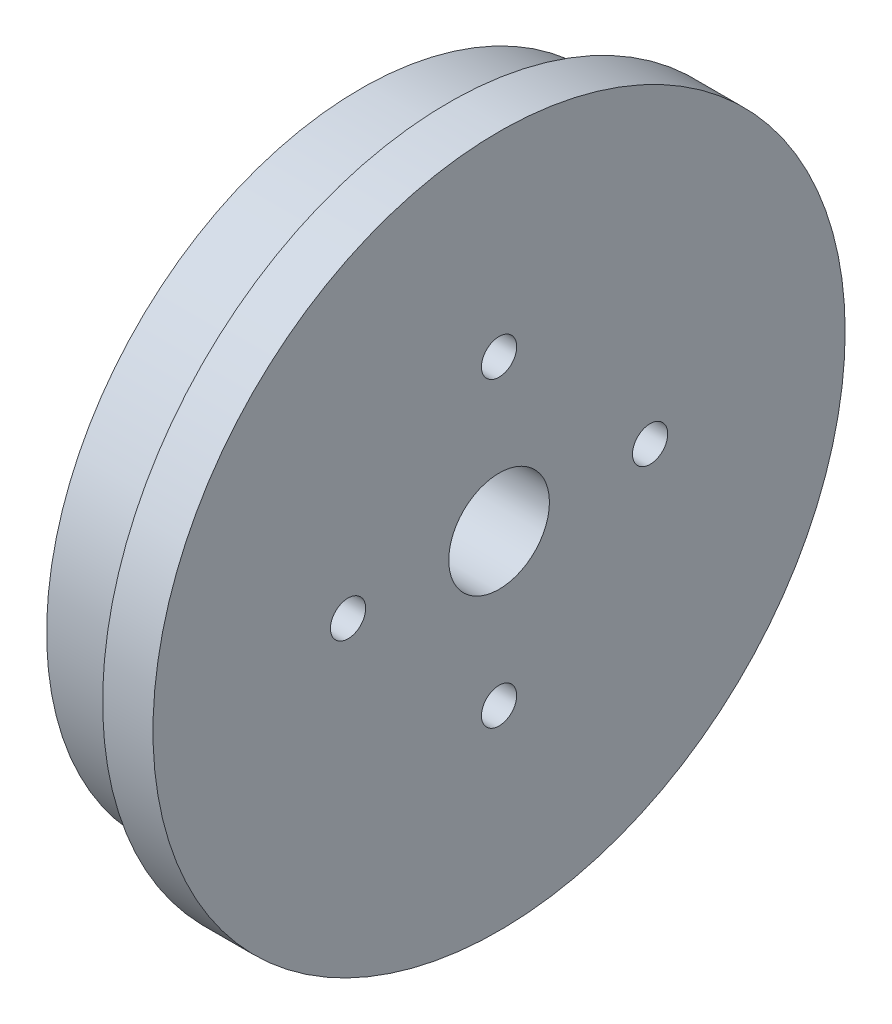
ISO-10303-21;
HEADER;
FILE_DESCRIPTION(('STEP AP214'),'2;1');
FILE_NAME('part.step','',(''),(''),'','','');
FILE_SCHEMA(('AUTOMOTIVE_DESIGN { 1 0 10303 214 1 1 1 1 }'));
ENDSEC;
DATA;
#1=APPLICATION_CONTEXT('core data for automotive mechanical design processes');
#2=APPLICATION_PROTOCOL_DEFINITION('international standard','automotive_design',2000,#1);
#3=PRODUCT_CONTEXT('',#1,'mechanical');
#4=PRODUCT('Part','Part','',(#3));
#5=PRODUCT_RELATED_PRODUCT_CATEGORY('part','',(#4));
#6=PRODUCT_DEFINITION_FORMATION('','',#4);
#7=PRODUCT_DEFINITION_CONTEXT('part definition',#1,'design');
#8=PRODUCT_DEFINITION('design','',#6,#7);
#9=PRODUCT_DEFINITION_SHAPE('','',#8);
#10=(LENGTH_UNIT() NAMED_UNIT(*) SI_UNIT(.MILLI.,.METRE.));
#11=(NAMED_UNIT(*) PLANE_ANGLE_UNIT() SI_UNIT($,.RADIAN.));
#12=(NAMED_UNIT(*) SI_UNIT($,.STERADIAN.) SOLID_ANGLE_UNIT());
#13=UNCERTAINTY_MEASURE_WITH_UNIT(LENGTH_MEASURE(1.E-05),#10,'distance_accuracy_value','');
#14=(GEOMETRIC_REPRESENTATION_CONTEXT(3) GLOBAL_UNCERTAINTY_ASSIGNED_CONTEXT((#13)) GLOBAL_UNIT_ASSIGNED_CONTEXT((#10,
#11,#12)) REPRESENTATION_CONTEXT('',''));
#15=CARTESIAN_POINT('',(0.,0.,0.));
#16=DIRECTION('',(0.,0.,1.));
#17=DIRECTION('',(1.,0.,0.));
#18=AXIS2_PLACEMENT_3D('',#15,#16,#17);
#19=CARTESIAN_POINT('',(7.,0.,0.));
#20=DIRECTION('',(-1.,0.,0.));
#21=DIRECTION('',(0.,0.,1.));
#22=AXIS2_PLACEMENT_3D('',#19,#20,#21);
#23=CYLINDRICAL_SURFACE('',#22,24.95);
#24=CARTESIAN_POINT('',(7.,0.,0.));
#25=DIRECTION('',(1.,0.,0.));
#26=DIRECTION('',(0.,0.,-1.));
#27=AXIS2_PLACEMENT_3D('',#24,#25,#26);
#28=CIRCLE('',#27,24.95);
#29=CARTESIAN_POINT('',(7.,0.,-24.95));
#30=VERTEX_POINT('',#29);
#31=EDGE_CURVE('E10',#30,#30,#28,.T.);
#32=ORIENTED_EDGE('',*,*,#31,.F.);
#33=EDGE_LOOP('',(#32));
#34=FACE_BOUND('',#33,.T.);
#35=CARTESIAN_POINT('',(0.,0.,0.));
#36=DIRECTION('',(1.,0.,0.));
#37=DIRECTION('',(0.,0.,-1.));
#38=AXIS2_PLACEMENT_3D('',#35,#36,#37);
#39=CIRCLE('',#38,24.95);
#40=CARTESIAN_POINT('',(0.,0.,-24.95));
#41=VERTEX_POINT('',#40);
#42=EDGE_CURVE('E37',#41,#41,#39,.T.);
#43=ORIENTED_EDGE('',*,*,#42,.T.);
#44=EDGE_LOOP('',(#43));
#45=FACE_BOUND('',#44,.T.);
#46=ADVANCED_FACE('F40',(#34,#45),#23,.T.);
#47=CARTESIAN_POINT('',(0.,0.,0.));
#48=DIRECTION('',(1.,0.,0.));
#49=DIRECTION('',(0.,0.,-1.));
#50=AXIS2_PLACEMENT_3D('',#47,#48,#49);
#51=PLANE('',#50);
#52=CARTESIAN_POINT('',(0.,20.,0.));
#53=DIRECTION('',(-1.,0.,0.));
#54=DIRECTION('',(0.,0.,1.));
#55=AXIS2_PLACEMENT_3D('',#52,#53,#54);
#56=CIRCLE('',#55,3.);
#57=CARTESIAN_POINT('',(0.,20.,3.));
#58=VERTEX_POINT('',#57);
#59=EDGE_CURVE('E109',#58,#58,#56,.T.);
#60=ORIENTED_EDGE('',*,*,#59,.F.);
#61=EDGE_LOOP('',(#60));
#62=FACE_BOUND('',#61,.T.);
#63=CARTESIAN_POINT('',(0.,9.,-17.3205080756888));
#64=DIRECTION('',(-1.,0.,0.));
#65=DIRECTION('',(0.,0.,1.));
#66=AXIS2_PLACEMENT_3D('',#63,#64,#65);
#67=CIRCLE('',#66,3.);
#68=CARTESIAN_POINT('',(0.,9.,-14.3205080756888));
#69=VERTEX_POINT('',#68);
#70=EDGE_CURVE('E90',#69,#69,#67,.T.);
#71=ORIENTED_EDGE('',*,*,#70,.F.);
#72=EDGE_LOOP('',(#71));
#73=FACE_BOUND('',#72,.T.);
#74=CARTESIAN_POINT('',(0.,-11.5000000000001,-16.4544826719044));
#75=DIRECTION('',(-1.,0.,0.));
#76=DIRECTION('',(0.,0.,1.));
#77=AXIS2_PLACEMENT_3D('',#74,#75,#76);
#78=CIRCLE('',#77,3.);
#79=CARTESIAN_POINT('',(0.,-11.5000000000001,-13.4544826719044));
#80=VERTEX_POINT('',#79);
#81=EDGE_CURVE('E86',#80,#80,#78,.T.);
#82=ORIENTED_EDGE('',*,*,#81,.F.);
#83=EDGE_LOOP('',(#82));
#84=FACE_BOUND('',#83,.T.);
#85=CARTESIAN_POINT('',(0.,-21.0000000000001,1.73205080756882));
#86=DIRECTION('',(-1.,0.,0.));
#87=DIRECTION('',(0.,0.,1.));
#88=AXIS2_PLACEMENT_3D('',#85,#86,#87);
#89=CIRCLE('',#88,3.);
#90=CARTESIAN_POINT('',(0.,-21.0000000000001,4.73205080756882));
#91=VERTEX_POINT('',#90);
#92=EDGE_CURVE('E92',#91,#91,#89,.T.);
#93=ORIENTED_EDGE('',*,*,#92,.F.);
#94=EDGE_LOOP('',(#93));
#95=FACE_BOUND('',#94,.T.);
#96=CARTESIAN_POINT('',(0.,-10.0000000000001,19.0525588832577));
#97=DIRECTION('',(-1.,0.,0.));
#98=DIRECTION('',(0.,0.,1.));
#99=AXIS2_PLACEMENT_3D('',#96,#97,#98);
#100=CIRCLE('',#99,3.);
#101=CARTESIAN_POINT('',(0.,-10.0000000000001,22.0525588832577));
#102=VERTEX_POINT('',#101);
#103=EDGE_CURVE('E101',#102,#102,#100,.T.);
#104=ORIENTED_EDGE('',*,*,#103,.F.);
#105=EDGE_LOOP('',(#104));
#106=FACE_BOUND('',#105,.T.);
#107=CARTESIAN_POINT('',(0.,10.5,18.1865334794732));
#108=DIRECTION('',(-1.,0.,0.));
#109=DIRECTION('',(0.,0.,1.));
#110=AXIS2_PLACEMENT_3D('',#107,#108,#109);
#111=CIRCLE('',#110,3.);
#112=CARTESIAN_POINT('',(0.,10.5,21.1865334794732));
#113=VERTEX_POINT('',#112);
#114=EDGE_CURVE('E110',#113,#113,#111,.T.);
#115=ORIENTED_EDGE('',*,*,#114,.F.);
#116=EDGE_LOOP('',(#115));
#117=FACE_BOUND('',#116,.T.);
#118=CARTESIAN_POINT('',(0.,0.,0.));
#119=DIRECTION('',(1.,0.,0.));
#120=DIRECTION('',(0.,0.,-1.));
#121=AXIS2_PLACEMENT_3D('',#118,#119,#120);
#122=CIRCLE('',#121,4.);
#123=CARTESIAN_POINT('',(0.,0.,-4.));
#124=VERTEX_POINT('',#123);
#125=EDGE_CURVE('E55',#124,#124,#122,.T.);
#126=ORIENTED_EDGE('',*,*,#125,.T.);
#127=EDGE_LOOP('',(#126));
#128=FACE_BOUND('',#127,.T.);
#129=ORIENTED_EDGE('',*,*,#42,.F.);
#130=EDGE_LOOP('',(#129));
#131=FACE_BOUND('',#130,.T.);
#132=ADVANCED_FACE('F128',(#62,#73,#84,#95,#106,#117,#128,#131),#51,.F.);
#133=CARTESIAN_POINT('',(11.,0.,0.));
#134=DIRECTION('',(-1.,0.,0.));
#135=DIRECTION('',(0.,0.,1.));
#136=AXIS2_PLACEMENT_3D('',#133,#134,#135);
#137=CYLINDRICAL_SURFACE('',#136,27.5);
#138=CARTESIAN_POINT('',(11.,0.,0.));
#139=DIRECTION('',(1.,0.,0.));
#140=DIRECTION('',(0.,0.,-1.));
#141=AXIS2_PLACEMENT_3D('',#138,#139,#140);
#142=CIRCLE('',#141,27.5);
#143=CARTESIAN_POINT('',(11.,0.,-27.5));
#144=VERTEX_POINT('',#143);
#145=EDGE_CURVE('E50',#144,#144,#142,.T.);
#146=ORIENTED_EDGE('',*,*,#145,.F.);
#147=EDGE_LOOP('',(#146));
#148=FACE_BOUND('',#147,.T.);
#149=CARTESIAN_POINT('',(7.,0.,0.));
#150=DIRECTION('',(1.,0.,0.));
#151=DIRECTION('',(0.,0.,-1.));
#152=AXIS2_PLACEMENT_3D('',#149,#150,#151);
#153=CIRCLE('',#152,27.5);
#154=CARTESIAN_POINT('',(7.,0.,-27.5));
#155=VERTEX_POINT('',#154);
#156=EDGE_CURVE('E47',#155,#155,#153,.T.);
#157=ORIENTED_EDGE('',*,*,#156,.T.);
#158=EDGE_LOOP('',(#157));
#159=FACE_BOUND('',#158,.T.);
#160=ADVANCED_FACE('F132',(#148,#159),#137,.T.);
#161=CARTESIAN_POINT('',(11.,0.,0.));
#162=DIRECTION('',(1.,0.,0.));
#163=DIRECTION('',(0.,0.,-1.));
#164=AXIS2_PLACEMENT_3D('',#161,#162,#163);
#165=PLANE('',#164);
#166=CARTESIAN_POINT('',(11.,0.,12.));
#167=DIRECTION('',(1.,0.,0.));
#168=DIRECTION('',(0.,0.,-1.));
#169=AXIS2_PLACEMENT_3D('',#166,#167,#168);
#170=CIRCLE('',#169,1.4);
#171=CARTESIAN_POINT('',(11.,0.,10.6));
#172=VERTEX_POINT('',#171);
#173=EDGE_CURVE('E79',#172,#172,#170,.T.);
#174=ORIENTED_EDGE('',*,*,#173,.F.);
#175=EDGE_LOOP('',(#174));
#176=FACE_BOUND('',#175,.T.);
#177=CARTESIAN_POINT('',(11.,12.,0.));
#178=DIRECTION('',(1.,0.,0.));
#179=DIRECTION('',(0.,0.,-1.));
#180=AXIS2_PLACEMENT_3D('',#177,#178,#179);
#181=CIRCLE('',#180,1.4);
#182=CARTESIAN_POINT('',(11.,12.,-1.40000000000004));
#183=VERTEX_POINT('',#182);
#184=EDGE_CURVE('E80',#183,#183,#181,.T.);
#185=ORIENTED_EDGE('',*,*,#184,.F.);
#186=EDGE_LOOP('',(#185));
#187=FACE_BOUND('',#186,.T.);
#188=CARTESIAN_POINT('',(11.,0.,-12.));
#189=DIRECTION('',(1.,0.,0.));
#190=DIRECTION('',(0.,0.,-1.));
#191=AXIS2_PLACEMENT_3D('',#188,#189,#190);
#192=CIRCLE('',#191,1.4);
#193=CARTESIAN_POINT('',(11.,0.,-13.4));
#194=VERTEX_POINT('',#193);
#195=EDGE_CURVE('E72',#194,#194,#192,.T.);
#196=ORIENTED_EDGE('',*,*,#195,.F.);
#197=EDGE_LOOP('',(#196));
#198=FACE_BOUND('',#197,.T.);
#199=CARTESIAN_POINT('',(11.,-12.,1.25693328198353E-13));
#200=DIRECTION('',(1.,0.,0.));
#201=DIRECTION('',(0.,0.,-1.));
#202=AXIS2_PLACEMENT_3D('',#199,#200,#201);
#203=CIRCLE('',#202,1.4);
#204=CARTESIAN_POINT('',(11.,-12.,-1.39999999999987));
#205=VERTEX_POINT('',#204);
#206=EDGE_CURVE('E63',#205,#205,#203,.T.);
#207=ORIENTED_EDGE('',*,*,#206,.F.);
#208=EDGE_LOOP('',(#207));
#209=FACE_BOUND('',#208,.T.);
#210=CARTESIAN_POINT('',(11.,0.,0.));
#211=DIRECTION('',(1.,0.,0.));
#212=DIRECTION('',(0.,0.,-1.));
#213=AXIS2_PLACEMENT_3D('',#210,#211,#212);
#214=CIRCLE('',#213,4.);
#215=CARTESIAN_POINT('',(11.,0.,-4.));
#216=VERTEX_POINT('',#215);
#217=EDGE_CURVE('E54',#216,#216,#214,.T.);
#218=ORIENTED_EDGE('',*,*,#217,.F.);
#219=EDGE_LOOP('',(#218));
#220=FACE_BOUND('',#219,.T.);
#221=ORIENTED_EDGE('',*,*,#145,.T.);
#222=EDGE_LOOP('',(#221));
#223=FACE_BOUND('',#222,.T.);
#224=ADVANCED_FACE('F159',(#176,#187,#198,#209,#220,#223),#165,.T.);
#225=CARTESIAN_POINT('',(7.,0.,0.));
#226=DIRECTION('',(1.,0.,0.));
#227=DIRECTION('',(0.,0.,-1.));
#228=AXIS2_PLACEMENT_3D('',#225,#226,#227);
#229=PLANE('',#228);
#230=ORIENTED_EDGE('',*,*,#31,.T.);
#231=EDGE_LOOP('',(#230));
#232=FACE_BOUND('',#231,.T.);
#233=ORIENTED_EDGE('',*,*,#156,.F.);
#234=EDGE_LOOP('',(#233));
#235=FACE_BOUND('',#234,.T.);
#236=ADVANCED_FACE('F170',(#232,#235),#229,.F.);
#237=CARTESIAN_POINT('',(0.,0.,0.));
#238=DIRECTION('',(1.,0.,0.));
#239=DIRECTION('',(0.,0.,-1.));
#240=AXIS2_PLACEMENT_3D('',#237,#238,#239);
#241=CYLINDRICAL_SURFACE('',#240,4.);
#242=ORIENTED_EDGE('',*,*,#125,.F.);
#243=EDGE_LOOP('',(#242));
#244=FACE_BOUND('',#243,.T.);
#245=ORIENTED_EDGE('',*,*,#217,.T.);
#246=EDGE_LOOP('',(#245));
#247=FACE_BOUND('',#246,.T.);
#248=ADVANCED_FACE('F171',(#244,#247),#241,.F.);
#249=CARTESIAN_POINT('',(3.,-12.,1.25693328198353E-13));
#250=DIRECTION('',(1.,0.,0.));
#251=DIRECTION('',(0.,0.,-1.));
#252=AXIS2_PLACEMENT_3D('',#249,#250,#251);
#253=CYLINDRICAL_SURFACE('',#252,1.4);
#254=CARTESIAN_POINT('',(3.,-12.,1.25693328198353E-13));
#255=DIRECTION('',(1.,0.,0.));
#256=DIRECTION('',(0.,0.,-1.));
#257=AXIS2_PLACEMENT_3D('',#254,#255,#256);
#258=CIRCLE('',#257,1.4);
#259=CARTESIAN_POINT('',(3.,-12.,-1.39999999999987));
#260=VERTEX_POINT('',#259);
#261=EDGE_CURVE('E61',#260,#260,#258,.T.);
#262=ORIENTED_EDGE('',*,*,#261,.F.);
#263=EDGE_LOOP('',(#262));
#264=FACE_BOUND('',#263,.T.);
#265=ORIENTED_EDGE('',*,*,#206,.T.);
#266=EDGE_LOOP('',(#265));
#267=FACE_BOUND('',#266,.T.);
#268=ADVANCED_FACE('F177',(#264,#267),#253,.F.);
#269=CARTESIAN_POINT('',(3.,-12.,1.25693328198353E-13));
#270=DIRECTION('',(1.,0.,0.));
#271=DIRECTION('',(0.,0.,-1.));
#272=AXIS2_PLACEMENT_3D('',#269,#270,#271);
#273=PLANE('',#272);
#274=ORIENTED_EDGE('',*,*,#261,.T.);
#275=EDGE_LOOP('',(#274));
#276=FACE_BOUND('',#275,.T.);
#277=ADVANCED_FACE('F194',(#276),#273,.T.);
#278=CARTESIAN_POINT('',(3.,0.,-12.));
#279=DIRECTION('',(1.,0.,0.));
#280=DIRECTION('',(0.,0.,-1.));
#281=AXIS2_PLACEMENT_3D('',#278,#279,#280);
#282=CYLINDRICAL_SURFACE('',#281,1.4);
#283=CARTESIAN_POINT('',(3.,0.,-12.));
#284=DIRECTION('',(1.,0.,0.));
#285=DIRECTION('',(0.,0.,-1.));
#286=AXIS2_PLACEMENT_3D('',#283,#284,#285);
#287=CIRCLE('',#286,1.4);
#288=CARTESIAN_POINT('',(3.,0.,-13.4));
#289=VERTEX_POINT('',#288);
#290=EDGE_CURVE('E66',#289,#289,#287,.T.);
#291=ORIENTED_EDGE('',*,*,#290,.F.);
#292=EDGE_LOOP('',(#291));
#293=FACE_BOUND('',#292,.T.);
#294=ORIENTED_EDGE('',*,*,#195,.T.);
#295=EDGE_LOOP('',(#294));
#296=FACE_BOUND('',#295,.T.);
#297=ADVANCED_FACE('F204',(#293,#296),#282,.F.);
#298=CARTESIAN_POINT('',(3.,0.,-12.));
#299=DIRECTION('',(1.,0.,0.));
#300=DIRECTION('',(0.,0.,-1.));
#301=AXIS2_PLACEMENT_3D('',#298,#299,#300);
#302=PLANE('',#301);
#303=ORIENTED_EDGE('',*,*,#290,.T.);
#304=EDGE_LOOP('',(#303));
#305=FACE_BOUND('',#304,.T.);
#306=ADVANCED_FACE('F213',(#305),#302,.T.);
#307=CARTESIAN_POINT('',(3.,12.,0.));
#308=DIRECTION('',(1.,0.,0.));
#309=DIRECTION('',(0.,0.,-1.));
#310=AXIS2_PLACEMENT_3D('',#307,#308,#309);
#311=CYLINDRICAL_SURFACE('',#310,1.4);
#312=CARTESIAN_POINT('',(3.,12.,0.));
#313=DIRECTION('',(1.,0.,0.));
#314=DIRECTION('',(0.,0.,-1.));
#315=AXIS2_PLACEMENT_3D('',#312,#313,#314);
#316=CIRCLE('',#315,1.4);
#317=CARTESIAN_POINT('',(3.,12.,-1.40000000000004));
#318=VERTEX_POINT('',#317);
#319=EDGE_CURVE('E74',#318,#318,#316,.T.);
#320=ORIENTED_EDGE('',*,*,#319,.F.);
#321=EDGE_LOOP('',(#320));
#322=FACE_BOUND('',#321,.T.);
#323=ORIENTED_EDGE('',*,*,#184,.T.);
#324=EDGE_LOOP('',(#323));
#325=FACE_BOUND('',#324,.T.);
#326=ADVANCED_FACE('F225',(#322,#325),#311,.F.);
#327=CARTESIAN_POINT('',(3.,12.,0.));
#328=DIRECTION('',(1.,0.,0.));
#329=DIRECTION('',(0.,0.,-1.));
#330=AXIS2_PLACEMENT_3D('',#327,#328,#329);
#331=PLANE('',#330);
#332=ORIENTED_EDGE('',*,*,#319,.T.);
#333=EDGE_LOOP('',(#332));
#334=FACE_BOUND('',#333,.T.);
#335=ADVANCED_FACE('F233',(#334),#331,.T.);
#336=CARTESIAN_POINT('',(3.,0.,12.));
#337=DIRECTION('',(1.,0.,0.));
#338=DIRECTION('',(0.,0.,-1.));
#339=AXIS2_PLACEMENT_3D('',#336,#337,#338);
#340=CYLINDRICAL_SURFACE('',#339,1.4);
#341=CARTESIAN_POINT('',(3.,0.,12.));
#342=DIRECTION('',(1.,0.,0.));
#343=DIRECTION('',(0.,0.,-1.));
#344=AXIS2_PLACEMENT_3D('',#341,#342,#343);
#345=CIRCLE('',#344,1.4);
#346=CARTESIAN_POINT('',(3.,0.,10.6));
#347=VERTEX_POINT('',#346);
#348=EDGE_CURVE('E59',#347,#347,#345,.T.);
#349=ORIENTED_EDGE('',*,*,#348,.F.);
#350=EDGE_LOOP('',(#349));
#351=FACE_BOUND('',#350,.T.);
#352=ORIENTED_EDGE('',*,*,#173,.T.);
#353=EDGE_LOOP('',(#352));
#354=FACE_BOUND('',#353,.T.);
#355=ADVANCED_FACE('F238',(#351,#354),#340,.F.);
#356=CARTESIAN_POINT('',(3.,0.,12.));
#357=DIRECTION('',(1.,0.,0.));
#358=DIRECTION('',(0.,0.,-1.));
#359=AXIS2_PLACEMENT_3D('',#356,#357,#358);
#360=PLANE('',#359);
#361=ORIENTED_EDGE('',*,*,#348,.T.);
#362=EDGE_LOOP('',(#361));
#363=FACE_BOUND('',#362,.T.);
#364=ADVANCED_FACE('F247',(#363),#360,.T.);
#365=CARTESIAN_POINT('',(6.,10.5,18.1865334794732));
#366=DIRECTION('',(-1.,0.,0.));
#367=DIRECTION('',(0.,0.,1.));
#368=AXIS2_PLACEMENT_3D('',#365,#366,#367);
#369=CYLINDRICAL_SURFACE('',#368,3.);
#370=CARTESIAN_POINT('',(6.,10.5,18.1865334794732));
#371=DIRECTION('',(-1.,0.,0.));
#372=DIRECTION('',(0.,0.,1.));
#373=AXIS2_PLACEMENT_3D('',#370,#371,#372);
#374=CIRCLE('',#373,3.);
#375=CARTESIAN_POINT('',(6.,10.5,21.1865334794732));
#376=VERTEX_POINT('',#375);
#377=EDGE_CURVE('E102',#376,#376,#374,.T.);
#378=ORIENTED_EDGE('',*,*,#377,.F.);
#379=EDGE_LOOP('',(#378));
#380=FACE_BOUND('',#379,.T.);
#381=ORIENTED_EDGE('',*,*,#114,.T.);
#382=EDGE_LOOP('',(#381));
#383=FACE_BOUND('',#382,.T.);
#384=ADVANCED_FACE('F260',(#380,#383),#369,.F.);
#385=CARTESIAN_POINT('',(6.,10.5,18.1865334794732));
#386=DIRECTION('',(-1.,0.,0.));
#387=DIRECTION('',(0.,0.,1.));
#388=AXIS2_PLACEMENT_3D('',#385,#386,#387);
#389=PLANE('',#388);
#390=ORIENTED_EDGE('',*,*,#377,.T.);
#391=EDGE_LOOP('',(#390));
#392=FACE_BOUND('',#391,.T.);
#393=ADVANCED_FACE('F271',(#392),#389,.T.);
#394=CARTESIAN_POINT('',(6.,-10.0000000000001,19.0525588832577));
#395=DIRECTION('',(-1.,0.,0.));
#396=DIRECTION('',(0.,0.,1.));
#397=AXIS2_PLACEMENT_3D('',#394,#395,#396);
#398=CYLINDRICAL_SURFACE('',#397,3.);
#399=CARTESIAN_POINT('',(6.,-10.0000000000001,19.0525588832577));
#400=DIRECTION('',(-1.,0.,0.));
#401=DIRECTION('',(0.,0.,1.));
#402=AXIS2_PLACEMENT_3D('',#399,#400,#401);
#403=CIRCLE('',#402,3.);
#404=CARTESIAN_POINT('',(6.,-10.0000000000001,22.0525588832577));
#405=VERTEX_POINT('',#404);
#406=EDGE_CURVE('E98',#405,#405,#403,.T.);
#407=ORIENTED_EDGE('',*,*,#406,.F.);
#408=EDGE_LOOP('',(#407));
#409=FACE_BOUND('',#408,.T.);
#410=ORIENTED_EDGE('',*,*,#103,.T.);
#411=EDGE_LOOP('',(#410));
#412=FACE_BOUND('',#411,.T.);
#413=ADVANCED_FACE('F278',(#409,#412),#398,.F.);
#414=CARTESIAN_POINT('',(6.,-10.0000000000001,19.0525588832577));
#415=DIRECTION('',(-1.,0.,0.));
#416=DIRECTION('',(0.,0.,1.));
#417=AXIS2_PLACEMENT_3D('',#414,#415,#416);
#418=PLANE('',#417);
#419=ORIENTED_EDGE('',*,*,#406,.T.);
#420=EDGE_LOOP('',(#419));
#421=FACE_BOUND('',#420,.T.);
#422=ADVANCED_FACE('F287',(#421),#418,.T.);
#423=CARTESIAN_POINT('',(6.,-21.0000000000001,1.73205080756882));
#424=DIRECTION('',(-1.,0.,0.));
#425=DIRECTION('',(0.,0.,1.));
#426=AXIS2_PLACEMENT_3D('',#423,#424,#425);
#427=CYLINDRICAL_SURFACE('',#426,3.);
#428=CARTESIAN_POINT('',(6.,-21.0000000000001,1.73205080756882));
#429=DIRECTION('',(-1.,0.,0.));
#430=DIRECTION('',(0.,0.,1.));
#431=AXIS2_PLACEMENT_3D('',#428,#429,#430);
#432=CIRCLE('',#431,3.);
#433=CARTESIAN_POINT('',(6.,-21.0000000000001,4.73205080756882));
#434=VERTEX_POINT('',#433);
#435=EDGE_CURVE('E95',#434,#434,#432,.T.);
#436=ORIENTED_EDGE('',*,*,#435,.F.);
#437=EDGE_LOOP('',(#436));
#438=FACE_BOUND('',#437,.T.);
#439=ORIENTED_EDGE('',*,*,#92,.T.);
#440=EDGE_LOOP('',(#439));
#441=FACE_BOUND('',#440,.T.);
#442=ADVANCED_FACE('F297',(#438,#441),#427,.F.);
#443=CARTESIAN_POINT('',(6.,-21.0000000000001,1.73205080756882));
#444=DIRECTION('',(-1.,0.,0.));
#445=DIRECTION('',(0.,0.,1.));
#446=AXIS2_PLACEMENT_3D('',#443,#444,#445);
#447=PLANE('',#446);
#448=ORIENTED_EDGE('',*,*,#435,.T.);
#449=EDGE_LOOP('',(#448));
#450=FACE_BOUND('',#449,.T.);
#451=ADVANCED_FACE('F307',(#450),#447,.T.);
#452=CARTESIAN_POINT('',(6.,-11.5000000000001,-16.4544826719044));
#453=DIRECTION('',(-1.,0.,0.));
#454=DIRECTION('',(0.,0.,1.));
#455=AXIS2_PLACEMENT_3D('',#452,#453,#454);
#456=CYLINDRICAL_SURFACE('',#455,3.);
#457=CARTESIAN_POINT('',(6.,-11.5000000000001,-16.4544826719044));
#458=DIRECTION('',(-1.,0.,0.));
#459=DIRECTION('',(0.,0.,1.));
#460=AXIS2_PLACEMENT_3D('',#457,#458,#459);
#461=CIRCLE('',#460,3.);
#462=CARTESIAN_POINT('',(6.,-11.5000000000001,-13.4544826719044));
#463=VERTEX_POINT('',#462);
#464=EDGE_CURVE('E84',#463,#463,#461,.T.);
#465=ORIENTED_EDGE('',*,*,#464,.F.);
#466=EDGE_LOOP('',(#465));
#467=FACE_BOUND('',#466,.T.);
#468=ORIENTED_EDGE('',*,*,#81,.T.);
#469=EDGE_LOOP('',(#468));
#470=FACE_BOUND('',#469,.T.);
#471=ADVANCED_FACE('F316',(#467,#470),#456,.F.);
#472=CARTESIAN_POINT('',(6.,-11.5000000000001,-16.4544826719044));
#473=DIRECTION('',(-1.,0.,0.));
#474=DIRECTION('',(0.,0.,1.));
#475=AXIS2_PLACEMENT_3D('',#472,#473,#474);
#476=PLANE('',#475);
#477=ORIENTED_EDGE('',*,*,#464,.T.);
#478=EDGE_LOOP('',(#477));
#479=FACE_BOUND('',#478,.T.);
#480=ADVANCED_FACE('F324',(#479),#476,.T.);
#481=CARTESIAN_POINT('',(6.,9.,-17.3205080756888));
#482=DIRECTION('',(-1.,0.,0.));
#483=DIRECTION('',(0.,0.,1.));
#484=AXIS2_PLACEMENT_3D('',#481,#482,#483);
#485=CYLINDRICAL_SURFACE('',#484,3.);
#486=CARTESIAN_POINT('',(6.,9.,-17.3205080756888));
#487=DIRECTION('',(-1.,0.,0.));
#488=DIRECTION('',(0.,0.,1.));
#489=AXIS2_PLACEMENT_3D('',#486,#487,#488);
#490=CIRCLE('',#489,3.);
#491=CARTESIAN_POINT('',(6.,9.,-14.3205080756888));
#492=VERTEX_POINT('',#491);
#493=EDGE_CURVE('E112',#492,#492,#490,.T.);
#494=ORIENTED_EDGE('',*,*,#493,.F.);
#495=EDGE_LOOP('',(#494));
#496=FACE_BOUND('',#495,.T.);
#497=ORIENTED_EDGE('',*,*,#70,.T.);
#498=EDGE_LOOP('',(#497));
#499=FACE_BOUND('',#498,.T.);
#500=ADVANCED_FACE('F331',(#496,#499),#485,.F.);
#501=CARTESIAN_POINT('',(6.,9.,-17.3205080756888));
#502=DIRECTION('',(-1.,0.,0.));
#503=DIRECTION('',(0.,0.,1.));
#504=AXIS2_PLACEMENT_3D('',#501,#502,#503);
#505=PLANE('',#504);
#506=ORIENTED_EDGE('',*,*,#493,.T.);
#507=EDGE_LOOP('',(#506));
#508=FACE_BOUND('',#507,.T.);
#509=ADVANCED_FACE('F127',(#508),#505,.T.);
#510=CARTESIAN_POINT('',(6.,20.,0.));
#511=DIRECTION('',(-1.,0.,0.));
#512=DIRECTION('',(0.,0.,1.));
#513=AXIS2_PLACEMENT_3D('',#510,#511,#512);
#514=CYLINDRICAL_SURFACE('',#513,3.);
#515=CARTESIAN_POINT('',(6.,20.,0.));
#516=DIRECTION('',(-1.,0.,0.));
#517=DIRECTION('',(0.,0.,1.));
#518=AXIS2_PLACEMENT_3D('',#515,#516,#517);
#519=CIRCLE('',#518,3.);
#520=CARTESIAN_POINT('',(6.,20.,3.));
#521=VERTEX_POINT('',#520);
#522=EDGE_CURVE('E64',#521,#521,#519,.T.);
#523=ORIENTED_EDGE('',*,*,#522,.F.);
#524=EDGE_LOOP('',(#523));
#525=FACE_BOUND('',#524,.T.);
#526=ORIENTED_EDGE('',*,*,#59,.T.);
#527=EDGE_LOOP('',(#526));
#528=FACE_BOUND('',#527,.T.);
#529=ADVANCED_FACE('F121',(#525,#528),#514,.F.);
#530=CARTESIAN_POINT('',(6.,20.,0.));
#531=DIRECTION('',(-1.,0.,0.));
#532=DIRECTION('',(0.,0.,1.));
#533=AXIS2_PLACEMENT_3D('',#530,#531,#532);
#534=PLANE('',#533);
#535=ORIENTED_EDGE('',*,*,#522,.T.);
#536=EDGE_LOOP('',(#535));
#537=FACE_BOUND('',#536,.T.);
#538=ADVANCED_FACE('F123',(#537),#534,.T.);
#539=CLOSED_SHELL('',(#46,#132,#160,#224,#236,#248,#268,#277,#297,#306,#326,#335,#355,#364,#384,
#393,#413,#422,#442,#451,#471,#480,#500,#509,#529,#538));
#540=MANIFOLD_SOLID_BREP('B2',#539);
#541=ADVANCED_BREP_SHAPE_REPRESENTATION('',(#18,#540),#14);
#542=SHAPE_DEFINITION_REPRESENTATION(#9,#541);
ENDSEC;
END-ISO-10303-21;
